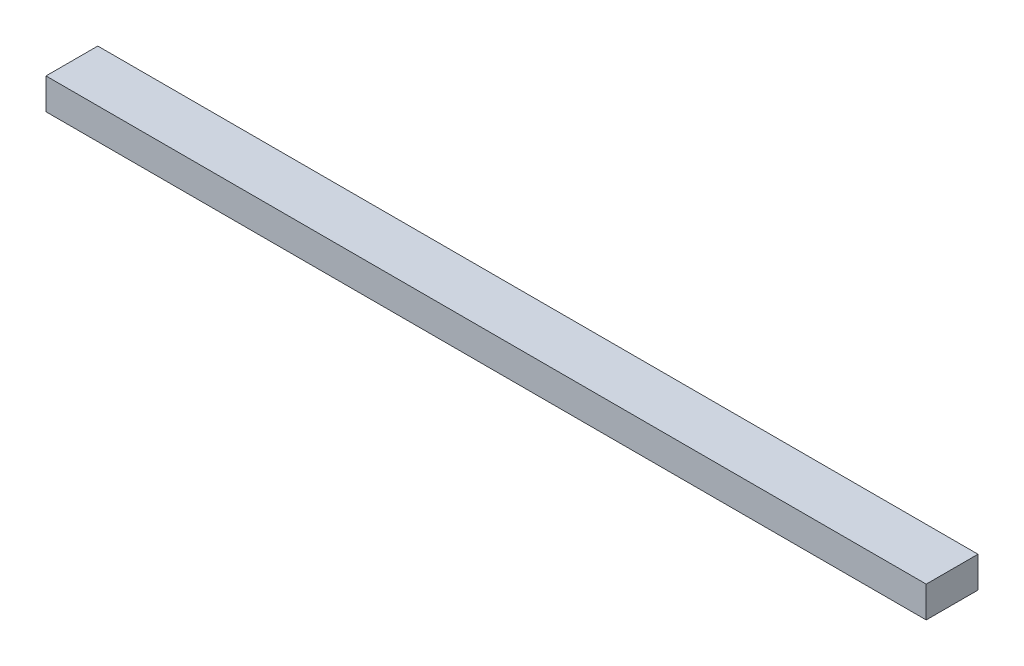
ISO-10303-21;
HEADER;
FILE_DESCRIPTION(('STEP AP214'),'2;1');
FILE_NAME('part.step','',(''),(''),'','','');
FILE_SCHEMA(('AUTOMOTIVE_DESIGN { 1 0 10303 214 1 1 1 1 }'));
ENDSEC;
DATA;
#1=APPLICATION_CONTEXT('core data for automotive mechanical design processes');
#2=APPLICATION_PROTOCOL_DEFINITION('international standard','automotive_design',2000,#1);
#3=PRODUCT_CONTEXT('',#1,'mechanical');
#4=PRODUCT('Part','Part','',(#3));
#5=PRODUCT_RELATED_PRODUCT_CATEGORY('part','',(#4));
#6=PRODUCT_DEFINITION_FORMATION('','',#4);
#7=PRODUCT_DEFINITION_CONTEXT('part definition',#1,'design');
#8=PRODUCT_DEFINITION('design','',#6,#7);
#9=PRODUCT_DEFINITION_SHAPE('','',#8);
#10=(LENGTH_UNIT() NAMED_UNIT(*) SI_UNIT(.MILLI.,.METRE.));
#11=(NAMED_UNIT(*) PLANE_ANGLE_UNIT() SI_UNIT($,.RADIAN.));
#12=(NAMED_UNIT(*) SI_UNIT($,.STERADIAN.) SOLID_ANGLE_UNIT());
#13=UNCERTAINTY_MEASURE_WITH_UNIT(LENGTH_MEASURE(1.E-05),#10,'distance_accuracy_value','');
#14=(GEOMETRIC_REPRESENTATION_CONTEXT(3) GLOBAL_UNCERTAINTY_ASSIGNED_CONTEXT((#13)) GLOBAL_UNIT_ASSIGNED_CONTEXT((#10,
#11,#12)) REPRESENTATION_CONTEXT('',''));
#15=CARTESIAN_POINT('',(0.,0.,0.));
#16=DIRECTION('',(0.,0.,1.));
#17=DIRECTION('',(1.,0.,0.));
#18=AXIS2_PLACEMENT_3D('',#15,#16,#17);
#19=CARTESIAN_POINT('',(85.,6.,-5.));
#20=DIRECTION('',(-1.,0.,0.));
#21=DIRECTION('',(0.,0.,1.));
#22=AXIS2_PLACEMENT_3D('',#19,#20,#21);
#23=PLANE('',#22);
#24=DIRECTION('',(0.,0.,-1.));
#25=VECTOR('',#24,1.);
#26=CARTESIAN_POINT('',(85.,0.,-5.));
#27=LINE('',#26,#25);
#28=CARTESIAN_POINT('',(85.,0.,5.));
#29=VERTEX_POINT('',#28);
#30=CARTESIAN_POINT('',(85.,0.,-5.));
#31=VERTEX_POINT('',#30);
#32=EDGE_CURVE('E107',#29,#31,#27,.T.);
#33=ORIENTED_EDGE('',*,*,#32,.T.);
#34=DIRECTION('',(0.,-1.,0.));
#35=VECTOR('',#34,1.);
#36=CARTESIAN_POINT('',(85.,6.,-5.));
#37=LINE('',#36,#35);
#38=CARTESIAN_POINT('',(85.,6.,-5.));
#39=VERTEX_POINT('',#38);
#40=EDGE_CURVE('E11',#39,#31,#37,.T.);
#41=ORIENTED_EDGE('',*,*,#40,.F.);
#42=DIRECTION('',(0.,0.,-1.));
#43=VECTOR('',#42,1.);
#44=CARTESIAN_POINT('',(85.,6.,-5.));
#45=LINE('',#44,#43);
#46=CARTESIAN_POINT('',(85.,6.,5.));
#47=VERTEX_POINT('',#46);
#48=EDGE_CURVE('E91',#47,#39,#45,.T.);
#49=ORIENTED_EDGE('',*,*,#48,.F.);
#50=DIRECTION('',(0.,-1.,0.));
#51=VECTOR('',#50,1.);
#52=CARTESIAN_POINT('',(85.,6.,5.));
#53=LINE('',#52,#51);
#54=EDGE_CURVE('E103',#47,#29,#53,.T.);
#55=ORIENTED_EDGE('',*,*,#54,.T.);
#56=EDGE_LOOP('',(#33,#41,#49,#55));
#57=FACE_BOUND('',#56,.T.);
#58=ADVANCED_FACE('F39',(#57),#23,.F.);
#59=CARTESIAN_POINT('',(-85.,6.,-5.));
#60=DIRECTION('',(0.,0.,1.));
#61=DIRECTION('',(1.,0.,0.));
#62=AXIS2_PLACEMENT_3D('',#59,#60,#61);
#63=PLANE('',#62);
#64=DIRECTION('',(-1.,0.,0.));
#65=VECTOR('',#64,1.);
#66=CARTESIAN_POINT('',(-85.,0.,-5.));
#67=LINE('',#66,#65);
#68=CARTESIAN_POINT('',(-85.,0.,-5.));
#69=VERTEX_POINT('',#68);
#70=EDGE_CURVE('E96',#31,#69,#67,.T.);
#71=ORIENTED_EDGE('',*,*,#70,.T.);
#72=DIRECTION('',(0.,-1.,0.));
#73=VECTOR('',#72,1.);
#74=CARTESIAN_POINT('',(-85.,6.,-5.));
#75=LINE('',#74,#73);
#76=CARTESIAN_POINT('',(-85.,6.,-5.));
#77=VERTEX_POINT('',#76);
#78=EDGE_CURVE('E48',#77,#69,#75,.T.);
#79=ORIENTED_EDGE('',*,*,#78,.F.);
#80=DIRECTION('',(-1.,0.,0.));
#81=VECTOR('',#80,1.);
#82=CARTESIAN_POINT('',(-85.,6.,-5.));
#83=LINE('',#82,#81);
#84=EDGE_CURVE('E86',#39,#77,#83,.T.);
#85=ORIENTED_EDGE('',*,*,#84,.F.);
#86=ORIENTED_EDGE('',*,*,#40,.T.);
#87=EDGE_LOOP('',(#71,#79,#85,#86));
#88=FACE_BOUND('',#87,.T.);
#89=ADVANCED_FACE('F95',(#88),#63,.F.);
#90=CARTESIAN_POINT('',(-85.,6.,-5.));
#91=DIRECTION('',(1.,0.,0.));
#92=DIRECTION('',(0.,0.,-1.));
#93=AXIS2_PLACEMENT_3D('',#90,#91,#92);
#94=PLANE('',#93);
#95=DIRECTION('',(0.,0.,1.));
#96=VECTOR('',#95,1.);
#97=CARTESIAN_POINT('',(-85.,0.,-5.));
#98=LINE('',#97,#96);
#99=CARTESIAN_POINT('',(-85.,0.,5.));
#100=VERTEX_POINT('',#99);
#101=EDGE_CURVE('E73',#69,#100,#98,.T.);
#102=ORIENTED_EDGE('',*,*,#101,.T.);
#103=DIRECTION('',(0.,-1.,0.));
#104=VECTOR('',#103,1.);
#105=CARTESIAN_POINT('',(-85.,6.,5.));
#106=LINE('',#105,#104);
#107=CARTESIAN_POINT('',(-85.,6.,5.));
#108=VERTEX_POINT('',#107);
#109=EDGE_CURVE('E98',#108,#100,#106,.T.);
#110=ORIENTED_EDGE('',*,*,#109,.F.);
#111=DIRECTION('',(0.,0.,1.));
#112=VECTOR('',#111,1.);
#113=CARTESIAN_POINT('',(-85.,6.,-5.));
#114=LINE('',#113,#112);
#115=EDGE_CURVE('E89',#77,#108,#114,.T.);
#116=ORIENTED_EDGE('',*,*,#115,.F.);
#117=ORIENTED_EDGE('',*,*,#78,.T.);
#118=EDGE_LOOP('',(#102,#110,#116,#117));
#119=FACE_BOUND('',#118,.T.);
#120=ADVANCED_FACE('F99',(#119),#94,.F.);
#121=CARTESIAN_POINT('',(-85.,6.,5.));
#122=DIRECTION('',(0.,0.,-1.));
#123=DIRECTION('',(-1.,0.,0.));
#124=AXIS2_PLACEMENT_3D('',#121,#122,#123);
#125=PLANE('',#124);
#126=DIRECTION('',(1.,0.,0.));
#127=VECTOR('',#126,1.);
#128=CARTESIAN_POINT('',(-85.,0.,5.));
#129=LINE('',#128,#127);
#130=EDGE_CURVE('E79',#100,#29,#129,.T.);
#131=ORIENTED_EDGE('',*,*,#130,.T.);
#132=ORIENTED_EDGE('',*,*,#54,.F.);
#133=DIRECTION('',(1.,0.,0.));
#134=VECTOR('',#133,1.);
#135=CARTESIAN_POINT('',(-85.,6.,5.));
#136=LINE('',#135,#134);
#137=EDGE_CURVE('E56',#108,#47,#136,.T.);
#138=ORIENTED_EDGE('',*,*,#137,.F.);
#139=ORIENTED_EDGE('',*,*,#109,.T.);
#140=EDGE_LOOP('',(#131,#132,#138,#139));
#141=FACE_BOUND('',#140,.T.);
#142=ADVANCED_FACE('F120',(#141),#125,.F.);
#143=CARTESIAN_POINT('',(0.,6.,0.));
#144=DIRECTION('',(0.,1.,0.));
#145=DIRECTION('',(0.,0.,1.));
#146=AXIS2_PLACEMENT_3D('',#143,#144,#145);
#147=PLANE('',#146);
#148=ORIENTED_EDGE('',*,*,#48,.T.);
#149=ORIENTED_EDGE('',*,*,#84,.T.);
#150=ORIENTED_EDGE('',*,*,#115,.T.);
#151=ORIENTED_EDGE('',*,*,#137,.T.);
#152=EDGE_LOOP('',(#148,#149,#150,#151));
#153=FACE_BOUND('',#152,.T.);
#154=ADVANCED_FACE('F87',(#153),#147,.T.);
#155=CARTESIAN_POINT('',(0.,0.,0.));
#156=DIRECTION('',(0.,1.,0.));
#157=DIRECTION('',(0.,0.,1.));
#158=AXIS2_PLACEMENT_3D('',#155,#156,#157);
#159=PLANE('',#158);
#160=ORIENTED_EDGE('',*,*,#32,.F.);
#161=ORIENTED_EDGE('',*,*,#130,.F.);
#162=ORIENTED_EDGE('',*,*,#101,.F.);
#163=ORIENTED_EDGE('',*,*,#70,.F.);
#164=EDGE_LOOP('',(#160,#161,#162,#163));
#165=FACE_BOUND('',#164,.T.);
#166=ADVANCED_FACE('F123',(#165),#159,.F.);
#167=CLOSED_SHELL('',(#58,#89,#120,#142,#154,#166));
#168=MANIFOLD_SOLID_BREP('B2',#167);
#169=ADVANCED_BREP_SHAPE_REPRESENTATION('',(#18,#168),#14);
#170=SHAPE_DEFINITION_REPRESENTATION(#9,#169);
ENDSEC;
END-ISO-10303-21;
